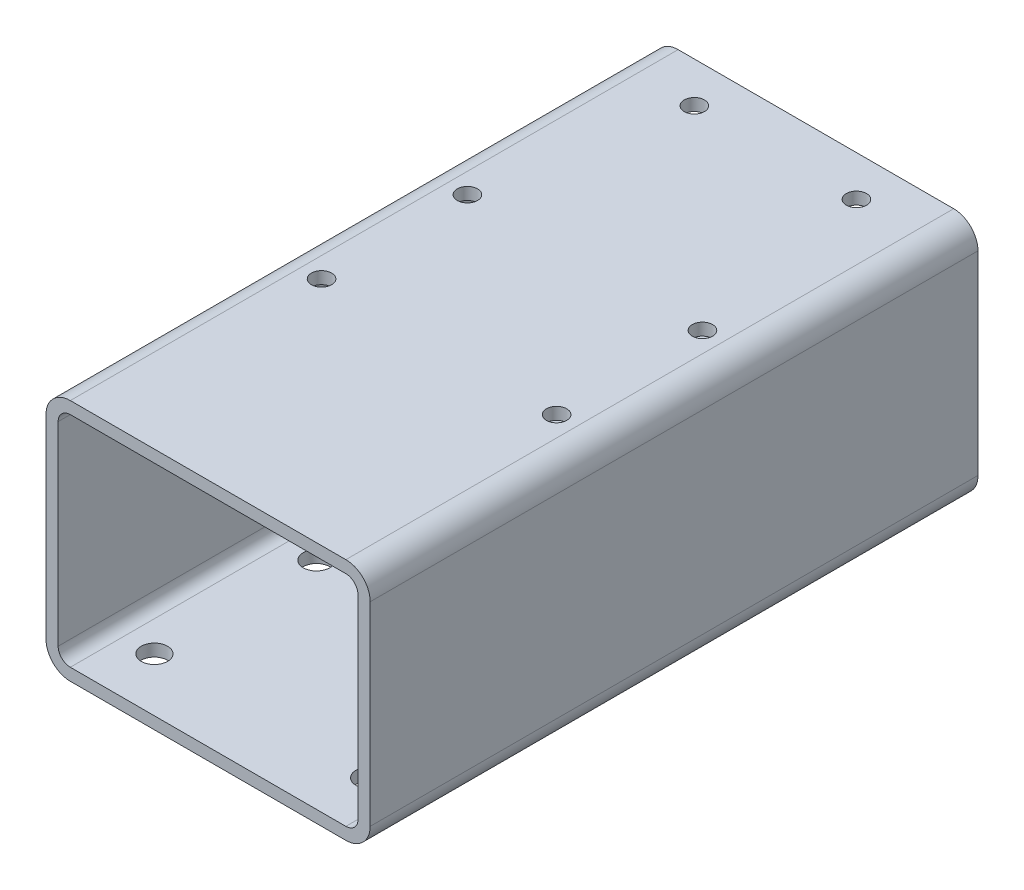
ISO-10303-21;
HEADER;
FILE_DESCRIPTION(('STEP AP214'),'2;1');
FILE_NAME('part.step','',(''),(''),'','','');
FILE_SCHEMA(('AUTOMOTIVE_DESIGN { 1 0 10303 214 1 1 1 1 }'));
ENDSEC;
DATA;
#1=APPLICATION_CONTEXT('core data for automotive mechanical design processes');
#2=APPLICATION_PROTOCOL_DEFINITION('international standard','automotive_design',2000,#1);
#3=PRODUCT_CONTEXT('',#1,'mechanical');
#4=PRODUCT('Part','Part','',(#3));
#5=PRODUCT_RELATED_PRODUCT_CATEGORY('part','',(#4));
#6=PRODUCT_DEFINITION_FORMATION('','',#4);
#7=PRODUCT_DEFINITION_CONTEXT('part definition',#1,'design');
#8=PRODUCT_DEFINITION('design','',#6,#7);
#9=PRODUCT_DEFINITION_SHAPE('','',#8);
#10=(LENGTH_UNIT() NAMED_UNIT(*) SI_UNIT(.MILLI.,.METRE.));
#11=(NAMED_UNIT(*) PLANE_ANGLE_UNIT() SI_UNIT($,.RADIAN.));
#12=(NAMED_UNIT(*) SI_UNIT($,.STERADIAN.) SOLID_ANGLE_UNIT());
#13=UNCERTAINTY_MEASURE_WITH_UNIT(LENGTH_MEASURE(1.E-05),#10,'distance_accuracy_value','');
#14=(GEOMETRIC_REPRESENTATION_CONTEXT(3) GLOBAL_UNCERTAINTY_ASSIGNED_CONTEXT((#13)) GLOBAL_UNIT_ASSIGNED_CONTEXT((#10,
#11,#12)) REPRESENTATION_CONTEXT('',''));
#15=CARTESIAN_POINT('',(0.,0.,0.));
#16=DIRECTION('',(0.,0.,1.));
#17=DIRECTION('',(1.,0.,0.));
#18=AXIS2_PLACEMENT_3D('',#15,#16,#17);
#19=CARTESIAN_POINT('',(-34.,24.,-75.));
#20=DIRECTION('',(0.,0.,1.));
#21=DIRECTION('',(1.,0.,0.));
#22=AXIS2_PLACEMENT_3D('',#19,#20,#21);
#23=CYLINDRICAL_SURFACE('',#22,6.);
#24=DIRECTION('',(0.,0.,1.));
#25=VECTOR('',#24,1.);
#26=CARTESIAN_POINT('',(-40.,24.,-75.));
#27=LINE('',#26,#25);
#28=CARTESIAN_POINT('',(-40.,24.,-75.));
#29=VERTEX_POINT('',#28);
#30=CARTESIAN_POINT('',(-40.,24.,75.));
#31=VERTEX_POINT('',#30);
#32=EDGE_CURVE('E42',#29,#31,#27,.T.);
#33=ORIENTED_EDGE('',*,*,#32,.T.);
#34=CARTESIAN_POINT('',(-34.,24.,75.));
#35=DIRECTION('',(0.,0.,1.));
#36=DIRECTION('',(-1.,0.,0.));
#37=AXIS2_PLACEMENT_3D('',#34,#35,#36);
#38=CIRCLE('',#37,6.);
#39=CARTESIAN_POINT('',(-34.,30.,75.));
#40=VERTEX_POINT('',#39);
#41=EDGE_CURVE('E197',#40,#31,#38,.T.);
#42=ORIENTED_EDGE('',*,*,#41,.F.);
#43=DIRECTION('',(0.,0.,1.));
#44=VECTOR('',#43,1.);
#45=CARTESIAN_POINT('',(-34.,30.,-75.));
#46=LINE('',#45,#44);
#47=CARTESIAN_POINT('',(-34.,30.,-75.));
#48=VERTEX_POINT('',#47);
#49=EDGE_CURVE('E11',#48,#40,#46,.T.);
#50=ORIENTED_EDGE('',*,*,#49,.F.);
#51=CARTESIAN_POINT('',(-34.,24.,-75.));
#52=DIRECTION('',(0.,0.,1.));
#53=DIRECTION('',(-1.,0.,0.));
#54=AXIS2_PLACEMENT_3D('',#51,#52,#53);
#55=CIRCLE('',#54,6.);
#56=EDGE_CURVE('E240',#48,#29,#55,.T.);
#57=ORIENTED_EDGE('',*,*,#56,.T.);
#58=EDGE_LOOP('',(#33,#42,#50,#57));
#59=FACE_BOUND('',#58,.T.);
#60=ADVANCED_FACE('F39',(#59),#23,.T.);
#61=CARTESIAN_POINT('',(-34.,30.,-75.));
#62=DIRECTION('',(0.,1.,0.));
#63=DIRECTION('',(-1.,0.,0.));
#64=AXIS2_PLACEMENT_3D('',#61,#62,#63);
#65=PLANE('',#64);
#66=CARTESIAN_POINT('',(29.0000000011443,30.,-18.0000000000055));
#67=DIRECTION('',(0.,1.,0.));
#68=DIRECTION('',(0.,0.,1.));
#69=AXIS2_PLACEMENT_3D('',#66,#67,#68);
#70=CIRCLE('',#69,2.5);
#71=CARTESIAN_POINT('',(29.0000000011443,30.,-15.5000000000055));
#72=VERTEX_POINT('',#71);
#73=EDGE_CURVE('E716',#72,#72,#70,.T.);
#74=ORIENTED_EDGE('',*,*,#73,.F.);
#75=EDGE_LOOP('',(#74));
#76=FACE_BOUND('',#75,.T.);
#77=CARTESIAN_POINT('',(29.0000000011443,30.,17.9999999999944));
#78=DIRECTION('',(0.,1.,0.));
#79=DIRECTION('',(0.,0.,1.));
#80=AXIS2_PLACEMENT_3D('',#77,#78,#79);
#81=CIRCLE('',#80,2.5);
#82=CARTESIAN_POINT('',(29.0000000011443,30.,20.4999999999945));
#83=VERTEX_POINT('',#82);
#84=EDGE_CURVE('E710',#83,#83,#81,.T.);
#85=ORIENTED_EDGE('',*,*,#84,.F.);
#86=EDGE_LOOP('',(#85));
#87=FACE_BOUND('',#86,.T.);
#88=CARTESIAN_POINT('',(-28.9999999988557,30.,17.9999999999944));
#89=DIRECTION('',(0.,1.,0.));
#90=DIRECTION('',(0.,0.,1.));
#91=AXIS2_PLACEMENT_3D('',#88,#89,#90);
#92=CIRCLE('',#91,2.5);
#93=CARTESIAN_POINT('',(-28.9999999988557,30.,20.4999999999944));
#94=VERTEX_POINT('',#93);
#95=EDGE_CURVE('E704',#94,#94,#92,.T.);
#96=ORIENTED_EDGE('',*,*,#95,.F.);
#97=EDGE_LOOP('',(#96));
#98=FACE_BOUND('',#97,.T.);
#99=CARTESIAN_POINT('',(-28.9999999988557,30.,-18.0000000000055));
#100=DIRECTION('',(0.,1.,0.));
#101=DIRECTION('',(0.,0.,1.));
#102=AXIS2_PLACEMENT_3D('',#99,#100,#101);
#103=CIRCLE('',#102,2.5);
#104=CARTESIAN_POINT('',(-28.9999999988557,30.,-15.5000000000056));
#105=VERTEX_POINT('',#104);
#106=EDGE_CURVE('E698',#105,#105,#103,.T.);
#107=ORIENTED_EDGE('',*,*,#106,.F.);
#108=EDGE_LOOP('',(#107));
#109=FACE_BOUND('',#108,.T.);
#110=CARTESIAN_POINT('',(-19.9999999988565,30.,-65.0000000000091));
#111=DIRECTION('',(0.,1.,0.));
#112=DIRECTION('',(0.,0.,1.));
#113=AXIS2_PLACEMENT_3D('',#110,#111,#112);
#114=CIRCLE('',#113,2.5);
#115=CARTESIAN_POINT('',(-19.9999999988565,30.,-62.5000000000091));
#116=VERTEX_POINT('',#115);
#117=EDGE_CURVE('E692',#116,#116,#114,.T.);
#118=ORIENTED_EDGE('',*,*,#117,.F.);
#119=EDGE_LOOP('',(#118));
#120=FACE_BOUND('',#119,.T.);
#121=CARTESIAN_POINT('',(20.0000000011434,30.,-65.0000000000081));
#122=DIRECTION('',(0.,1.,0.));
#123=DIRECTION('',(0.,0.,1.));
#124=AXIS2_PLACEMENT_3D('',#121,#122,#123);
#125=CIRCLE('',#124,2.5);
#126=CARTESIAN_POINT('',(20.0000000011434,30.,-62.5000000000081));
#127=VERTEX_POINT('',#126);
#128=EDGE_CURVE('E686',#127,#127,#125,.T.);
#129=ORIENTED_EDGE('',*,*,#128,.F.);
#130=EDGE_LOOP('',(#129));
#131=FACE_BOUND('',#130,.T.);
#132=ORIENTED_EDGE('',*,*,#49,.T.);
#133=DIRECTION('',(-1.,0.,0.));
#134=VECTOR('',#133,1.);
#135=CARTESIAN_POINT('',(-34.,30.,75.));
#136=LINE('',#135,#134);
#137=CARTESIAN_POINT('',(34.,30.,75.));
#138=VERTEX_POINT('',#137);
#139=EDGE_CURVE('E218',#138,#40,#136,.T.);
#140=ORIENTED_EDGE('',*,*,#139,.F.);
#141=DIRECTION('',(0.,0.,1.));
#142=VECTOR('',#141,1.);
#143=CARTESIAN_POINT('',(34.,30.,-75.));
#144=LINE('',#143,#142);
#145=CARTESIAN_POINT('',(34.,30.,-75.));
#146=VERTEX_POINT('',#145);
#147=EDGE_CURVE('E47',#146,#138,#144,.T.);
#148=ORIENTED_EDGE('',*,*,#147,.F.);
#149=DIRECTION('',(-1.,0.,0.));
#150=VECTOR('',#149,1.);
#151=CARTESIAN_POINT('',(-34.,30.,-75.));
#152=LINE('',#151,#150);
#153=EDGE_CURVE('E271',#146,#48,#152,.T.);
#154=ORIENTED_EDGE('',*,*,#153,.T.);
#155=EDGE_LOOP('',(#132,#140,#148,#154));
#156=FACE_BOUND('',#155,.T.);
#157=ADVANCED_FACE('F292',(#76,#87,#98,#109,#120,#131,#156),#65,.T.);
#158=CARTESIAN_POINT('',(34.,24.,-75.));
#159=DIRECTION('',(0.,0.,1.));
#160=DIRECTION('',(1.,0.,0.));
#161=AXIS2_PLACEMENT_3D('',#158,#159,#160);
#162=CYLINDRICAL_SURFACE('',#161,6.);
#163=ORIENTED_EDGE('',*,*,#147,.T.);
#164=CARTESIAN_POINT('',(34.,24.,75.));
#165=DIRECTION('',(0.,0.,1.));
#166=DIRECTION('',(1.,0.,0.));
#167=AXIS2_PLACEMENT_3D('',#164,#165,#166);
#168=CIRCLE('',#167,6.);
#169=CARTESIAN_POINT('',(40.,24.,75.));
#170=VERTEX_POINT('',#169);
#171=EDGE_CURVE('E215',#170,#138,#168,.T.);
#172=ORIENTED_EDGE('',*,*,#171,.F.);
#173=DIRECTION('',(0.,0.,1.));
#174=VECTOR('',#173,1.);
#175=CARTESIAN_POINT('',(40.,24.,-75.));
#176=LINE('',#175,#174);
#177=CARTESIAN_POINT('',(40.,24.,-75.));
#178=VERTEX_POINT('',#177);
#179=EDGE_CURVE('E275',#178,#170,#176,.T.);
#180=ORIENTED_EDGE('',*,*,#179,.F.);
#181=CARTESIAN_POINT('',(34.,24.,-75.));
#182=DIRECTION('',(0.,0.,1.));
#183=DIRECTION('',(1.,0.,0.));
#184=AXIS2_PLACEMENT_3D('',#181,#182,#183);
#185=CIRCLE('',#184,6.);
#186=EDGE_CURVE('E268',#178,#146,#185,.T.);
#187=ORIENTED_EDGE('',*,*,#186,.T.);
#188=EDGE_LOOP('',(#163,#172,#180,#187));
#189=FACE_BOUND('',#188,.T.);
#190=ADVANCED_FACE('F313',(#189),#162,.T.);
#191=CARTESIAN_POINT('',(40.,-24.,-75.));
#192=DIRECTION('',(1.,0.,0.));
#193=DIRECTION('',(0.,0.,-1.));
#194=AXIS2_PLACEMENT_3D('',#191,#192,#193);
#195=PLANE('',#194);
#196=ORIENTED_EDGE('',*,*,#179,.T.);
#197=DIRECTION('',(0.,1.,0.));
#198=VECTOR('',#197,1.);
#199=CARTESIAN_POINT('',(40.,-24.,75.));
#200=LINE('',#199,#198);
#201=CARTESIAN_POINT('',(40.,-24.,75.));
#202=VERTEX_POINT('',#201);
#203=EDGE_CURVE('E212',#202,#170,#200,.T.);
#204=ORIENTED_EDGE('',*,*,#203,.F.);
#205=DIRECTION('',(0.,0.,1.));
#206=VECTOR('',#205,1.);
#207=CARTESIAN_POINT('',(40.,-24.,-75.));
#208=LINE('',#207,#206);
#209=CARTESIAN_POINT('',(40.,-24.,-75.));
#210=VERTEX_POINT('',#209);
#211=EDGE_CURVE('E277',#210,#202,#208,.T.);
#212=ORIENTED_EDGE('',*,*,#211,.F.);
#213=DIRECTION('',(0.,1.,0.));
#214=VECTOR('',#213,1.);
#215=CARTESIAN_POINT('',(40.,-24.,-75.));
#216=LINE('',#215,#214);
#217=EDGE_CURVE('E265',#210,#178,#216,.T.);
#218=ORIENTED_EDGE('',*,*,#217,.T.);
#219=EDGE_LOOP('',(#196,#204,#212,#218));
#220=FACE_BOUND('',#219,.T.);
#221=ADVANCED_FACE('F310',(#220),#195,.T.);
#222=CARTESIAN_POINT('',(34.,-24.,-75.));
#223=DIRECTION('',(0.,0.,1.));
#224=DIRECTION('',(1.,0.,0.));
#225=AXIS2_PLACEMENT_3D('',#222,#223,#224);
#226=CYLINDRICAL_SURFACE('',#225,6.);
#227=ORIENTED_EDGE('',*,*,#211,.T.);
#228=CARTESIAN_POINT('',(34.,-24.,75.));
#229=DIRECTION('',(0.,0.,1.));
#230=DIRECTION('',(1.,0.,0.));
#231=AXIS2_PLACEMENT_3D('',#228,#229,#230);
#232=CIRCLE('',#231,6.);
#233=CARTESIAN_POINT('',(34.,-30.,75.));
#234=VERTEX_POINT('',#233);
#235=EDGE_CURVE('E209',#234,#202,#232,.T.);
#236=ORIENTED_EDGE('',*,*,#235,.F.);
#237=DIRECTION('',(0.,0.,1.));
#238=VECTOR('',#237,1.);
#239=CARTESIAN_POINT('',(34.,-30.,-75.));
#240=LINE('',#239,#238);
#241=CARTESIAN_POINT('',(34.,-30.,-75.));
#242=VERTEX_POINT('',#241);
#243=EDGE_CURVE('E279',#242,#234,#240,.T.);
#244=ORIENTED_EDGE('',*,*,#243,.F.);
#245=CARTESIAN_POINT('',(34.,-24.,-75.));
#246=DIRECTION('',(0.,0.,1.));
#247=DIRECTION('',(1.,0.,0.));
#248=AXIS2_PLACEMENT_3D('',#245,#246,#247);
#249=CIRCLE('',#248,6.);
#250=EDGE_CURVE('E262',#242,#210,#249,.T.);
#251=ORIENTED_EDGE('',*,*,#250,.T.);
#252=EDGE_LOOP('',(#227,#236,#244,#251));
#253=FACE_BOUND('',#252,.T.);
#254=ADVANCED_FACE('F308',(#253),#226,.T.);
#255=CARTESIAN_POINT('',(-34.,-30.,-75.));
#256=DIRECTION('',(0.,-1.,0.));
#257=DIRECTION('',(0.,0.,-1.));
#258=AXIS2_PLACEMENT_3D('',#255,#256,#257);
#259=PLANE('',#258);
#260=CARTESIAN_POINT('',(-26.5,-30.,61.75));
#261=DIRECTION('',(0.,-1.,0.));
#262=DIRECTION('',(0.,0.,-1.));
#263=AXIS2_PLACEMENT_3D('',#260,#261,#262);
#264=CIRCLE('',#263,3.24999999999999);
#265=CARTESIAN_POINT('',(-26.5,-30.,58.5));
#266=VERTEX_POINT('',#265);
#267=EDGE_CURVE('E623',#266,#266,#264,.T.);
#268=ORIENTED_EDGE('',*,*,#267,.F.);
#269=EDGE_LOOP('',(#268));
#270=FACE_BOUND('',#269,.T.);
#271=CARTESIAN_POINT('',(26.5,-30.,61.75));
#272=DIRECTION('',(0.,-1.,0.));
#273=DIRECTION('',(0.,0.,-1.));
#274=AXIS2_PLACEMENT_3D('',#271,#272,#273);
#275=CIRCLE('',#274,3.24999999999999);
#276=CARTESIAN_POINT('',(26.5,-30.,58.5));
#277=VERTEX_POINT('',#276);
#278=EDGE_CURVE('E627',#277,#277,#275,.T.);
#279=ORIENTED_EDGE('',*,*,#278,.F.);
#280=EDGE_LOOP('',(#279));
#281=FACE_BOUND('',#280,.T.);
#282=CARTESIAN_POINT('',(26.5,-30.,21.75));
#283=DIRECTION('',(0.,-1.,0.));
#284=DIRECTION('',(0.,0.,-1.));
#285=AXIS2_PLACEMENT_3D('',#282,#283,#284);
#286=CIRCLE('',#285,3.24999999999999);
#287=CARTESIAN_POINT('',(26.5,-30.,18.5));
#288=VERTEX_POINT('',#287);
#289=EDGE_CURVE('E631',#288,#288,#286,.T.);
#290=ORIENTED_EDGE('',*,*,#289,.F.);
#291=EDGE_LOOP('',(#290));
#292=FACE_BOUND('',#291,.T.);
#293=CARTESIAN_POINT('',(-26.5,-30.,21.75));
#294=DIRECTION('',(0.,-1.,0.));
#295=DIRECTION('',(0.,0.,-1.));
#296=AXIS2_PLACEMENT_3D('',#293,#294,#295);
#297=CIRCLE('',#296,3.24999999999999);
#298=CARTESIAN_POINT('',(-26.5,-30.,18.5));
#299=VERTEX_POINT('',#298);
#300=EDGE_CURVE('E635',#299,#299,#297,.T.);
#301=ORIENTED_EDGE('',*,*,#300,.F.);
#302=EDGE_LOOP('',(#301));
#303=FACE_BOUND('',#302,.T.);
#304=CARTESIAN_POINT('',(-26.5,-30.,-21.75));
#305=DIRECTION('',(0.,-1.,0.));
#306=DIRECTION('',(0.,0.,-1.));
#307=AXIS2_PLACEMENT_3D('',#304,#305,#306);
#308=CIRCLE('',#307,3.24999999999999);
#309=CARTESIAN_POINT('',(-26.5,-30.,-25.));
#310=VERTEX_POINT('',#309);
#311=EDGE_CURVE('E639',#310,#310,#308,.T.);
#312=ORIENTED_EDGE('',*,*,#311,.F.);
#313=EDGE_LOOP('',(#312));
#314=FACE_BOUND('',#313,.T.);
#315=CARTESIAN_POINT('',(26.5,-30.,-21.75));
#316=DIRECTION('',(0.,-1.,0.));
#317=DIRECTION('',(0.,0.,-1.));
#318=AXIS2_PLACEMENT_3D('',#315,#316,#317);
#319=CIRCLE('',#318,3.24999999999999);
#320=CARTESIAN_POINT('',(26.5,-30.,-25.));
#321=VERTEX_POINT('',#320);
#322=EDGE_CURVE('E643',#321,#321,#319,.T.);
#323=ORIENTED_EDGE('',*,*,#322,.F.);
#324=EDGE_LOOP('',(#323));
#325=FACE_BOUND('',#324,.T.);
#326=CARTESIAN_POINT('',(26.5,-30.,-61.75));
#327=DIRECTION('',(0.,-1.,0.));
#328=DIRECTION('',(0.,0.,-1.));
#329=AXIS2_PLACEMENT_3D('',#326,#327,#328);
#330=CIRCLE('',#329,3.24999999999999);
#331=CARTESIAN_POINT('',(26.5,-30.,-65.));
#332=VERTEX_POINT('',#331);
#333=EDGE_CURVE('E647',#332,#332,#330,.T.);
#334=ORIENTED_EDGE('',*,*,#333,.F.);
#335=EDGE_LOOP('',(#334));
#336=FACE_BOUND('',#335,.T.);
#337=CARTESIAN_POINT('',(-26.5,-30.,-61.75));
#338=DIRECTION('',(0.,-1.,0.));
#339=DIRECTION('',(0.,0.,-1.));
#340=AXIS2_PLACEMENT_3D('',#337,#338,#339);
#341=CIRCLE('',#340,3.24999999999999);
#342=CARTESIAN_POINT('',(-26.5,-30.,-65.));
#343=VERTEX_POINT('',#342);
#344=EDGE_CURVE('E650',#343,#343,#341,.T.);
#345=ORIENTED_EDGE('',*,*,#344,.F.);
#346=EDGE_LOOP('',(#345));
#347=FACE_BOUND('',#346,.T.);
#348=ORIENTED_EDGE('',*,*,#243,.T.);
#349=DIRECTION('',(1.,0.,0.));
#350=VECTOR('',#349,1.);
#351=CARTESIAN_POINT('',(-34.,-30.,75.));
#352=LINE('',#351,#350);
#353=CARTESIAN_POINT('',(-34.,-30.,75.));
#354=VERTEX_POINT('',#353);
#355=EDGE_CURVE('E206',#354,#234,#352,.T.);
#356=ORIENTED_EDGE('',*,*,#355,.F.);
#357=DIRECTION('',(0.,0.,1.));
#358=VECTOR('',#357,1.);
#359=CARTESIAN_POINT('',(-34.,-30.,-75.));
#360=LINE('',#359,#358);
#361=CARTESIAN_POINT('',(-34.,-30.,-75.));
#362=VERTEX_POINT('',#361);
#363=EDGE_CURVE('E281',#362,#354,#360,.T.);
#364=ORIENTED_EDGE('',*,*,#363,.F.);
#365=DIRECTION('',(1.,0.,0.));
#366=VECTOR('',#365,1.);
#367=CARTESIAN_POINT('',(-34.,-30.,-75.));
#368=LINE('',#367,#366);
#369=EDGE_CURVE('E259',#362,#242,#368,.T.);
#370=ORIENTED_EDGE('',*,*,#369,.T.);
#371=EDGE_LOOP('',(#348,#356,#364,#370));
#372=FACE_BOUND('',#371,.T.);
#373=ADVANCED_FACE('F306',(#270,#281,#292,#303,#314,#325,#336,#347,#372),#259,.T.);
#374=CARTESIAN_POINT('',(-34.,-24.,-75.));
#375=DIRECTION('',(0.,0.,1.));
#376=DIRECTION('',(1.,0.,0.));
#377=AXIS2_PLACEMENT_3D('',#374,#375,#376);
#378=CYLINDRICAL_SURFACE('',#377,6.);
#379=ORIENTED_EDGE('',*,*,#363,.T.);
#380=CARTESIAN_POINT('',(-34.,-24.,75.));
#381=DIRECTION('',(0.,0.,1.));
#382=DIRECTION('',(-1.,0.,0.));
#383=AXIS2_PLACEMENT_3D('',#380,#381,#382);
#384=CIRCLE('',#383,6.);
#385=CARTESIAN_POINT('',(-40.,-24.,75.));
#386=VERTEX_POINT('',#385);
#387=EDGE_CURVE('E203',#386,#354,#384,.T.);
#388=ORIENTED_EDGE('',*,*,#387,.F.);
#389=DIRECTION('',(0.,0.,1.));
#390=VECTOR('',#389,1.);
#391=CARTESIAN_POINT('',(-40.,-24.,-75.));
#392=LINE('',#391,#390);
#393=CARTESIAN_POINT('',(-40.,-24.,-75.));
#394=VERTEX_POINT('',#393);
#395=EDGE_CURVE('E282',#394,#386,#392,.T.);
#396=ORIENTED_EDGE('',*,*,#395,.F.);
#397=CARTESIAN_POINT('',(-34.,-24.,-75.));
#398=DIRECTION('',(0.,0.,1.));
#399=DIRECTION('',(-1.,0.,0.));
#400=AXIS2_PLACEMENT_3D('',#397,#398,#399);
#401=CIRCLE('',#400,6.);
#402=EDGE_CURVE('E256',#394,#362,#401,.T.);
#403=ORIENTED_EDGE('',*,*,#402,.T.);
#404=EDGE_LOOP('',(#379,#388,#396,#403));
#405=FACE_BOUND('',#404,.T.);
#406=ADVANCED_FACE('F302',(#405),#378,.T.);
#407=CARTESIAN_POINT('',(-40.,-24.,-75.));
#408=DIRECTION('',(-1.,0.,0.));
#409=DIRECTION('',(0.,0.,1.));
#410=AXIS2_PLACEMENT_3D('',#407,#408,#409);
#411=PLANE('',#410);
#412=ORIENTED_EDGE('',*,*,#395,.T.);
#413=DIRECTION('',(0.,-1.,0.));
#414=VECTOR('',#413,1.);
#415=CARTESIAN_POINT('',(-40.,-24.,75.));
#416=LINE('',#415,#414);
#417=EDGE_CURVE('E200',#31,#386,#416,.T.);
#418=ORIENTED_EDGE('',*,*,#417,.F.);
#419=ORIENTED_EDGE('',*,*,#32,.F.);
#420=DIRECTION('',(0.,-1.,0.));
#421=VECTOR('',#420,1.);
#422=CARTESIAN_POINT('',(-40.,-24.,-75.));
#423=LINE('',#422,#421);
#424=EDGE_CURVE('E253',#29,#394,#423,.T.);
#425=ORIENTED_EDGE('',*,*,#424,.T.);
#426=EDGE_LOOP('',(#412,#418,#419,#425));
#427=FACE_BOUND('',#426,.T.);
#428=ADVANCED_FACE('F286',(#427),#411,.T.);
#429=CARTESIAN_POINT('',(-34.,24.,-75.));
#430=DIRECTION('',(0.,0.,-1.));
#431=DIRECTION('',(-1.,0.,0.));
#432=AXIS2_PLACEMENT_3D('',#429,#430,#431);
#433=PLANE('',#432);
#434=CARTESIAN_POINT('',(-34.,24.,-75.));
#435=DIRECTION('',(0.,0.,1.));
#436=DIRECTION('',(-1.,0.,0.));
#437=AXIS2_PLACEMENT_3D('',#434,#435,#436);
#438=CIRCLE('',#437,3.);
#439=CARTESIAN_POINT('',(-34.,27.,-75.));
#440=VERTEX_POINT('',#439);
#441=CARTESIAN_POINT('',(-37.,24.,-75.));
#442=VERTEX_POINT('',#441);
#443=EDGE_CURVE('E221',#440,#442,#438,.T.);
#444=ORIENTED_EDGE('',*,*,#443,.T.);
#445=DIRECTION('',(0.,-1.,0.));
#446=VECTOR('',#445,1.);
#447=CARTESIAN_POINT('',(-37.,-24.,-75.));
#448=LINE('',#447,#446);
#449=CARTESIAN_POINT('',(-37.,-24.,-75.));
#450=VERTEX_POINT('',#449);
#451=EDGE_CURVE('E159',#442,#450,#448,.T.);
#452=ORIENTED_EDGE('',*,*,#451,.T.);
#453=CARTESIAN_POINT('',(-34.,-24.,-75.));
#454=DIRECTION('',(0.,0.,1.));
#455=DIRECTION('',(-1.,0.,0.));
#456=AXIS2_PLACEMENT_3D('',#453,#454,#455);
#457=CIRCLE('',#456,3.);
#458=CARTESIAN_POINT('',(-34.,-27.,-75.));
#459=VERTEX_POINT('',#458);
#460=EDGE_CURVE('E55',#450,#459,#457,.T.);
#461=ORIENTED_EDGE('',*,*,#460,.T.);
#462=DIRECTION('',(1.,0.,0.));
#463=VECTOR('',#462,1.);
#464=CARTESIAN_POINT('',(-34.,-27.,-75.));
#465=LINE('',#464,#463);
#466=CARTESIAN_POINT('',(34.,-27.,-75.));
#467=VERTEX_POINT('',#466);
#468=EDGE_CURVE('E225',#459,#467,#465,.T.);
#469=ORIENTED_EDGE('',*,*,#468,.T.);
#470=CARTESIAN_POINT('',(34.,-24.,-75.));
#471=DIRECTION('',(0.,0.,1.));
#472=DIRECTION('',(1.,0.,0.));
#473=AXIS2_PLACEMENT_3D('',#470,#471,#472);
#474=CIRCLE('',#473,3.);
#475=CARTESIAN_POINT('',(37.,-24.,-75.));
#476=VERTEX_POINT('',#475);
#477=EDGE_CURVE('E228',#467,#476,#474,.T.);
#478=ORIENTED_EDGE('',*,*,#477,.T.);
#479=DIRECTION('',(0.,1.,0.));
#480=VECTOR('',#479,1.);
#481=CARTESIAN_POINT('',(37.,-24.,-75.));
#482=LINE('',#481,#480);
#483=CARTESIAN_POINT('',(37.,24.,-75.));
#484=VERTEX_POINT('',#483);
#485=EDGE_CURVE('E231',#476,#484,#482,.T.);
#486=ORIENTED_EDGE('',*,*,#485,.T.);
#487=CARTESIAN_POINT('',(34.,24.,-75.));
#488=DIRECTION('',(0.,0.,1.));
#489=DIRECTION('',(1.,0.,0.));
#490=AXIS2_PLACEMENT_3D('',#487,#488,#489);
#491=CIRCLE('',#490,3.);
#492=CARTESIAN_POINT('',(34.,27.,-75.));
#493=VERTEX_POINT('',#492);
#494=EDGE_CURVE('E234',#484,#493,#491,.T.);
#495=ORIENTED_EDGE('',*,*,#494,.T.);
#496=DIRECTION('',(-1.,0.,0.));
#497=VECTOR('',#496,1.);
#498=CARTESIAN_POINT('',(-34.,27.,-75.));
#499=LINE('',#498,#497);
#500=EDGE_CURVE('E164',#493,#440,#499,.T.);
#501=ORIENTED_EDGE('',*,*,#500,.T.);
#502=EDGE_LOOP('',(#444,#452,#461,#469,#478,#486,#495,#501));
#503=FACE_BOUND('',#502,.T.);
#504=ORIENTED_EDGE('',*,*,#56,.F.);
#505=ORIENTED_EDGE('',*,*,#153,.F.);
#506=ORIENTED_EDGE('',*,*,#186,.F.);
#507=ORIENTED_EDGE('',*,*,#217,.F.);
#508=ORIENTED_EDGE('',*,*,#250,.F.);
#509=ORIENTED_EDGE('',*,*,#369,.F.);
#510=ORIENTED_EDGE('',*,*,#402,.F.);
#511=ORIENTED_EDGE('',*,*,#424,.F.);
#512=EDGE_LOOP('',(#504,#505,#506,#507,#508,#509,#510,#511));
#513=FACE_BOUND('',#512,.T.);
#514=ADVANCED_FACE('F296',(#503,#513),#433,.T.);
#515=CARTESIAN_POINT('',(-34.,24.,-75.));
#516=DIRECTION('',(0.,0.,1.));
#517=DIRECTION('',(1.,0.,0.));
#518=AXIS2_PLACEMENT_3D('',#515,#516,#517);
#519=CYLINDRICAL_SURFACE('',#518,3.);
#520=DIRECTION('',(0.,0.,1.));
#521=VECTOR('',#520,1.);
#522=CARTESIAN_POINT('',(-34.,27.,-75.));
#523=LINE('',#522,#521);
#524=CARTESIAN_POINT('',(-34.,27.,75.));
#525=VERTEX_POINT('',#524);
#526=EDGE_CURVE('E169',#440,#525,#523,.T.);
#527=ORIENTED_EDGE('',*,*,#526,.T.);
#528=CARTESIAN_POINT('',(-34.,24.,75.));
#529=DIRECTION('',(0.,0.,1.));
#530=DIRECTION('',(-1.,0.,0.));
#531=AXIS2_PLACEMENT_3D('',#528,#529,#530);
#532=CIRCLE('',#531,3.);
#533=CARTESIAN_POINT('',(-37.,24.,75.));
#534=VERTEX_POINT('',#533);
#535=EDGE_CURVE('E167',#525,#534,#532,.T.);
#536=ORIENTED_EDGE('',*,*,#535,.T.);
#537=DIRECTION('',(0.,0.,1.));
#538=VECTOR('',#537,1.);
#539=CARTESIAN_POINT('',(-37.,24.,-75.));
#540=LINE('',#539,#538);
#541=EDGE_CURVE('E152',#442,#534,#540,.T.);
#542=ORIENTED_EDGE('',*,*,#541,.F.);
#543=ORIENTED_EDGE('',*,*,#443,.F.);
#544=EDGE_LOOP('',(#527,#536,#542,#543));
#545=FACE_BOUND('',#544,.T.);
#546=ADVANCED_FACE('F168',(#545),#519,.F.);
#547=CARTESIAN_POINT('',(-34.,27.,-75.));
#548=DIRECTION('',(0.,1.,0.));
#549=DIRECTION('',(0.,0.,1.));
#550=AXIS2_PLACEMENT_3D('',#547,#548,#549);
#551=PLANE('',#550);
#552=CARTESIAN_POINT('',(29.0000000011443,27.,-18.0000000000055));
#553=DIRECTION('',(0.,1.,0.));
#554=DIRECTION('',(0.,0.,1.));
#555=AXIS2_PLACEMENT_3D('',#552,#553,#554);
#556=CIRCLE('',#555,2.5);
#557=CARTESIAN_POINT('',(29.0000000011443,27.,-15.5000000000055));
#558=VERTEX_POINT('',#557);
#559=EDGE_CURVE('E713',#558,#558,#556,.T.);
#560=ORIENTED_EDGE('',*,*,#559,.T.);
#561=EDGE_LOOP('',(#560));
#562=FACE_BOUND('',#561,.T.);
#563=CARTESIAN_POINT('',(29.0000000011443,27.,17.9999999999944));
#564=DIRECTION('',(0.,1.,0.));
#565=DIRECTION('',(0.,0.,1.));
#566=AXIS2_PLACEMENT_3D('',#563,#564,#565);
#567=CIRCLE('',#566,2.5);
#568=CARTESIAN_POINT('',(29.0000000011443,27.,20.4999999999945));
#569=VERTEX_POINT('',#568);
#570=EDGE_CURVE('E707',#569,#569,#567,.T.);
#571=ORIENTED_EDGE('',*,*,#570,.T.);
#572=EDGE_LOOP('',(#571));
#573=FACE_BOUND('',#572,.T.);
#574=CARTESIAN_POINT('',(-28.9999999988557,27.,17.9999999999944));
#575=DIRECTION('',(0.,1.,0.));
#576=DIRECTION('',(0.,0.,1.));
#577=AXIS2_PLACEMENT_3D('',#574,#575,#576);
#578=CIRCLE('',#577,2.5);
#579=CARTESIAN_POINT('',(-28.9999999988557,27.,20.4999999999944));
#580=VERTEX_POINT('',#579);
#581=EDGE_CURVE('E701',#580,#580,#578,.T.);
#582=ORIENTED_EDGE('',*,*,#581,.T.);
#583=EDGE_LOOP('',(#582));
#584=FACE_BOUND('',#583,.T.);
#585=CARTESIAN_POINT('',(-28.9999999988557,27.,-18.0000000000055));
#586=DIRECTION('',(0.,1.,0.));
#587=DIRECTION('',(0.,0.,1.));
#588=AXIS2_PLACEMENT_3D('',#585,#586,#587);
#589=CIRCLE('',#588,2.5);
#590=CARTESIAN_POINT('',(-28.9999999988557,27.,-15.5000000000056));
#591=VERTEX_POINT('',#590);
#592=EDGE_CURVE('E695',#591,#591,#589,.T.);
#593=ORIENTED_EDGE('',*,*,#592,.T.);
#594=EDGE_LOOP('',(#593));
#595=FACE_BOUND('',#594,.T.);
#596=CARTESIAN_POINT('',(-19.9999999988565,27.,-65.0000000000091));
#597=DIRECTION('',(0.,1.,0.));
#598=DIRECTION('',(0.,0.,1.));
#599=AXIS2_PLACEMENT_3D('',#596,#597,#598);
#600=CIRCLE('',#599,2.5);
#601=CARTESIAN_POINT('',(-19.9999999988565,27.,-62.5000000000091));
#602=VERTEX_POINT('',#601);
#603=EDGE_CURVE('E689',#602,#602,#600,.T.);
#604=ORIENTED_EDGE('',*,*,#603,.T.);
#605=EDGE_LOOP('',(#604));
#606=FACE_BOUND('',#605,.T.);
#607=CARTESIAN_POINT('',(20.0000000011434,27.,-65.0000000000081));
#608=DIRECTION('',(0.,1.,0.));
#609=DIRECTION('',(0.,0.,1.));
#610=AXIS2_PLACEMENT_3D('',#607,#608,#609);
#611=CIRCLE('',#610,2.5);
#612=CARTESIAN_POINT('',(20.0000000011434,27.,-62.5000000000081));
#613=VERTEX_POINT('',#612);
#614=EDGE_CURVE('E683',#613,#613,#611,.T.);
#615=ORIENTED_EDGE('',*,*,#614,.T.);
#616=EDGE_LOOP('',(#615));
#617=FACE_BOUND('',#616,.T.);
#618=DIRECTION('',(0.,0.,1.));
#619=VECTOR('',#618,1.);
#620=CARTESIAN_POINT('',(34.,27.,-75.));
#621=LINE('',#620,#619);
#622=CARTESIAN_POINT('',(34.,27.,75.));
#623=VERTEX_POINT('',#622);
#624=EDGE_CURVE('E241',#493,#623,#621,.T.);
#625=ORIENTED_EDGE('',*,*,#624,.T.);
#626=DIRECTION('',(-1.,0.,0.));
#627=VECTOR('',#626,1.);
#628=CARTESIAN_POINT('',(-34.,27.,75.));
#629=LINE('',#628,#627);
#630=EDGE_CURVE('E195',#623,#525,#629,.T.);
#631=ORIENTED_EDGE('',*,*,#630,.T.);
#632=ORIENTED_EDGE('',*,*,#526,.F.);
#633=ORIENTED_EDGE('',*,*,#500,.F.);
#634=EDGE_LOOP('',(#625,#631,#632,#633));
#635=FACE_BOUND('',#634,.T.);
#636=ADVANCED_FACE('F342',(#562,#573,#584,#595,#606,#617,#635),#551,.F.);
#637=CARTESIAN_POINT('',(34.,24.,-75.));
#638=DIRECTION('',(0.,0.,1.));
#639=DIRECTION('',(1.,0.,0.));
#640=AXIS2_PLACEMENT_3D('',#637,#638,#639);
#641=CYLINDRICAL_SURFACE('',#640,3.);
#642=DIRECTION('',(0.,0.,1.));
#643=VECTOR('',#642,1.);
#644=CARTESIAN_POINT('',(37.,24.,-75.));
#645=LINE('',#644,#643);
#646=CARTESIAN_POINT('',(37.,24.,75.));
#647=VERTEX_POINT('',#646);
#648=EDGE_CURVE('E243',#484,#647,#645,.T.);
#649=ORIENTED_EDGE('',*,*,#648,.T.);
#650=CARTESIAN_POINT('',(34.,24.,75.));
#651=DIRECTION('',(0.,0.,1.));
#652=DIRECTION('',(1.,0.,0.));
#653=AXIS2_PLACEMENT_3D('',#650,#651,#652);
#654=CIRCLE('',#653,3.);
#655=EDGE_CURVE('E192',#647,#623,#654,.T.);
#656=ORIENTED_EDGE('',*,*,#655,.T.);
#657=ORIENTED_EDGE('',*,*,#624,.F.);
#658=ORIENTED_EDGE('',*,*,#494,.F.);
#659=EDGE_LOOP('',(#649,#656,#657,#658));
#660=FACE_BOUND('',#659,.T.);
#661=ADVANCED_FACE('F346',(#660),#641,.F.);
#662=CARTESIAN_POINT('',(37.,-24.,-75.));
#663=DIRECTION('',(1.,0.,0.));
#664=DIRECTION('',(0.,0.,-1.));
#665=AXIS2_PLACEMENT_3D('',#662,#663,#664);
#666=PLANE('',#665);
#667=DIRECTION('',(0.,0.,1.));
#668=VECTOR('',#667,1.);
#669=CARTESIAN_POINT('',(37.,-24.,-75.));
#670=LINE('',#669,#668);
#671=CARTESIAN_POINT('',(37.,-24.,75.));
#672=VERTEX_POINT('',#671);
#673=EDGE_CURVE('E245',#476,#672,#670,.T.);
#674=ORIENTED_EDGE('',*,*,#673,.T.);
#675=DIRECTION('',(0.,1.,0.));
#676=VECTOR('',#675,1.);
#677=CARTESIAN_POINT('',(37.,-24.,75.));
#678=LINE('',#677,#676);
#679=EDGE_CURVE('E189',#672,#647,#678,.T.);
#680=ORIENTED_EDGE('',*,*,#679,.T.);
#681=ORIENTED_EDGE('',*,*,#648,.F.);
#682=ORIENTED_EDGE('',*,*,#485,.F.);
#683=EDGE_LOOP('',(#674,#680,#681,#682));
#684=FACE_BOUND('',#683,.T.);
#685=ADVANCED_FACE('F448',(#684),#666,.F.);
#686=CARTESIAN_POINT('',(34.,-24.,-75.));
#687=DIRECTION('',(0.,0.,1.));
#688=DIRECTION('',(1.,0.,0.));
#689=AXIS2_PLACEMENT_3D('',#686,#687,#688);
#690=CYLINDRICAL_SURFACE('',#689,3.);
#691=DIRECTION('',(0.,0.,1.));
#692=VECTOR('',#691,1.);
#693=CARTESIAN_POINT('',(34.,-27.,-75.));
#694=LINE('',#693,#692);
#695=CARTESIAN_POINT('',(34.,-27.,75.));
#696=VERTEX_POINT('',#695);
#697=EDGE_CURVE('E247',#467,#696,#694,.T.);
#698=ORIENTED_EDGE('',*,*,#697,.T.);
#699=CARTESIAN_POINT('',(34.,-24.,75.));
#700=DIRECTION('',(0.,0.,1.));
#701=DIRECTION('',(1.,0.,0.));
#702=AXIS2_PLACEMENT_3D('',#699,#700,#701);
#703=CIRCLE('',#702,3.);
#704=EDGE_CURVE('E186',#696,#672,#703,.T.);
#705=ORIENTED_EDGE('',*,*,#704,.T.);
#706=ORIENTED_EDGE('',*,*,#673,.F.);
#707=ORIENTED_EDGE('',*,*,#477,.F.);
#708=EDGE_LOOP('',(#698,#705,#706,#707));
#709=FACE_BOUND('',#708,.T.);
#710=ADVANCED_FACE('F452',(#709),#690,.F.);
#711=CARTESIAN_POINT('',(-34.,-27.,-75.));
#712=DIRECTION('',(0.,-1.,0.));
#713=DIRECTION('',(1.,0.,0.));
#714=AXIS2_PLACEMENT_3D('',#711,#712,#713);
#715=PLANE('',#714);
#716=CARTESIAN_POINT('',(-26.5,-27.,61.75));
#717=DIRECTION('',(0.,-1.,0.));
#718=DIRECTION('',(1.,0.,0.));
#719=AXIS2_PLACEMENT_3D('',#716,#717,#718);
#720=CIRCLE('',#719,3.25);
#721=CARTESIAN_POINT('',(-23.25,-27.,61.75));
#722=VERTEX_POINT('',#721);
#723=EDGE_CURVE('E679',#722,#722,#720,.T.);
#724=ORIENTED_EDGE('',*,*,#723,.T.);
#725=EDGE_LOOP('',(#724));
#726=FACE_BOUND('',#725,.T.);
#727=CARTESIAN_POINT('',(26.5,-27.,61.75));
#728=DIRECTION('',(0.,-1.,0.));
#729=DIRECTION('',(1.,0.,0.));
#730=AXIS2_PLACEMENT_3D('',#727,#728,#729);
#731=CIRCLE('',#730,3.25);
#732=CARTESIAN_POINT('',(29.75,-27.,61.75));
#733=VERTEX_POINT('',#732);
#734=EDGE_CURVE('E675',#733,#733,#731,.T.);
#735=ORIENTED_EDGE('',*,*,#734,.T.);
#736=EDGE_LOOP('',(#735));
#737=FACE_BOUND('',#736,.T.);
#738=CARTESIAN_POINT('',(26.5,-27.,21.75));
#739=DIRECTION('',(0.,-1.,0.));
#740=DIRECTION('',(1.,0.,0.));
#741=AXIS2_PLACEMENT_3D('',#738,#739,#740);
#742=CIRCLE('',#741,3.25);
#743=CARTESIAN_POINT('',(29.75,-27.,21.75));
#744=VERTEX_POINT('',#743);
#745=EDGE_CURVE('E671',#744,#744,#742,.T.);
#746=ORIENTED_EDGE('',*,*,#745,.T.);
#747=EDGE_LOOP('',(#746));
#748=FACE_BOUND('',#747,.T.);
#749=CARTESIAN_POINT('',(-26.5,-27.,21.75));
#750=DIRECTION('',(0.,-1.,0.));
#751=DIRECTION('',(1.,0.,0.));
#752=AXIS2_PLACEMENT_3D('',#749,#750,#751);
#753=CIRCLE('',#752,3.25);
#754=CARTESIAN_POINT('',(-23.25,-27.,21.75));
#755=VERTEX_POINT('',#754);
#756=EDGE_CURVE('E667',#755,#755,#753,.T.);
#757=ORIENTED_EDGE('',*,*,#756,.T.);
#758=EDGE_LOOP('',(#757));
#759=FACE_BOUND('',#758,.T.);
#760=CARTESIAN_POINT('',(-26.5,-27.,-21.75));
#761=DIRECTION('',(0.,-1.,0.));
#762=DIRECTION('',(1.,0.,0.));
#763=AXIS2_PLACEMENT_3D('',#760,#761,#762);
#764=CIRCLE('',#763,3.25);
#765=CARTESIAN_POINT('',(-23.25,-27.,-21.75));
#766=VERTEX_POINT('',#765);
#767=EDGE_CURVE('E663',#766,#766,#764,.T.);
#768=ORIENTED_EDGE('',*,*,#767,.T.);
#769=EDGE_LOOP('',(#768));
#770=FACE_BOUND('',#769,.T.);
#771=CARTESIAN_POINT('',(26.5,-27.,-21.75));
#772=DIRECTION('',(0.,-1.,0.));
#773=DIRECTION('',(1.,0.,0.));
#774=AXIS2_PLACEMENT_3D('',#771,#772,#773);
#775=CIRCLE('',#774,3.25);
#776=CARTESIAN_POINT('',(29.75,-27.,-21.75));
#777=VERTEX_POINT('',#776);
#778=EDGE_CURVE('E659',#777,#777,#775,.T.);
#779=ORIENTED_EDGE('',*,*,#778,.T.);
#780=EDGE_LOOP('',(#779));
#781=FACE_BOUND('',#780,.T.);
#782=CARTESIAN_POINT('',(26.5,-27.,-61.75));
#783=DIRECTION('',(0.,-1.,0.));
#784=DIRECTION('',(1.,0.,0.));
#785=AXIS2_PLACEMENT_3D('',#782,#783,#784);
#786=CIRCLE('',#785,3.25);
#787=CARTESIAN_POINT('',(29.75,-27.,-61.75));
#788=VERTEX_POINT('',#787);
#789=EDGE_CURVE('E652',#788,#788,#786,.T.);
#790=ORIENTED_EDGE('',*,*,#789,.T.);
#791=EDGE_LOOP('',(#790));
#792=FACE_BOUND('',#791,.T.);
#793=CARTESIAN_POINT('',(-26.5,-27.,-61.75));
#794=DIRECTION('',(0.,-1.,0.));
#795=DIRECTION('',(1.,0.,0.));
#796=AXIS2_PLACEMENT_3D('',#793,#794,#795);
#797=CIRCLE('',#796,3.25);
#798=CARTESIAN_POINT('',(-23.25,-27.,-61.75));
#799=VERTEX_POINT('',#798);
#800=EDGE_CURVE('E173',#799,#799,#797,.T.);
#801=ORIENTED_EDGE('',*,*,#800,.T.);
#802=EDGE_LOOP('',(#801));
#803=FACE_BOUND('',#802,.T.);
#804=DIRECTION('',(0.,0.,1.));
#805=VECTOR('',#804,1.);
#806=CARTESIAN_POINT('',(-34.,-27.,-75.));
#807=LINE('',#806,#805);
#808=CARTESIAN_POINT('',(-34.,-27.,75.));
#809=VERTEX_POINT('',#808);
#810=EDGE_CURVE('E249',#459,#809,#807,.T.);
#811=ORIENTED_EDGE('',*,*,#810,.T.);
#812=DIRECTION('',(1.,0.,0.));
#813=VECTOR('',#812,1.);
#814=CARTESIAN_POINT('',(-34.,-27.,75.));
#815=LINE('',#814,#813);
#816=EDGE_CURVE('E180',#809,#696,#815,.T.);
#817=ORIENTED_EDGE('',*,*,#816,.T.);
#818=ORIENTED_EDGE('',*,*,#697,.F.);
#819=ORIENTED_EDGE('',*,*,#468,.F.);
#820=EDGE_LOOP('',(#811,#817,#818,#819));
#821=FACE_BOUND('',#820,.T.);
#822=ADVANCED_FACE('F456',(#726,#737,#748,#759,#770,#781,#792,#803,#821),#715,.F.);
#823=CARTESIAN_POINT('',(-34.,-24.,-75.));
#824=DIRECTION('',(0.,0.,1.));
#825=DIRECTION('',(1.,0.,0.));
#826=AXIS2_PLACEMENT_3D('',#823,#824,#825);
#827=CYLINDRICAL_SURFACE('',#826,3.);
#828=DIRECTION('',(0.,0.,1.));
#829=VECTOR('',#828,1.);
#830=CARTESIAN_POINT('',(-37.,-24.,-75.));
#831=LINE('',#830,#829);
#832=CARTESIAN_POINT('',(-37.,-24.,75.));
#833=VERTEX_POINT('',#832);
#834=EDGE_CURVE('E163',#450,#833,#831,.T.);
#835=ORIENTED_EDGE('',*,*,#834,.T.);
#836=CARTESIAN_POINT('',(-34.,-24.,75.));
#837=DIRECTION('',(0.,0.,1.));
#838=DIRECTION('',(-1.,0.,0.));
#839=AXIS2_PLACEMENT_3D('',#836,#837,#838);
#840=CIRCLE('',#839,3.);
#841=EDGE_CURVE('E178',#833,#809,#840,.T.);
#842=ORIENTED_EDGE('',*,*,#841,.T.);
#843=ORIENTED_EDGE('',*,*,#810,.F.);
#844=ORIENTED_EDGE('',*,*,#460,.F.);
#845=EDGE_LOOP('',(#835,#842,#843,#844));
#846=FACE_BOUND('',#845,.T.);
#847=ADVANCED_FACE('F460',(#846),#827,.F.);
#848=CARTESIAN_POINT('',(-37.,-24.,-75.));
#849=DIRECTION('',(-1.,0.,0.));
#850=DIRECTION('',(0.,0.,1.));
#851=AXIS2_PLACEMENT_3D('',#848,#849,#850);
#852=PLANE('',#851);
#853=ORIENTED_EDGE('',*,*,#541,.T.);
#854=DIRECTION('',(0.,-1.,0.));
#855=VECTOR('',#854,1.);
#856=CARTESIAN_POINT('',(-37.,-24.,75.));
#857=LINE('',#856,#855);
#858=EDGE_CURVE('E156',#534,#833,#857,.T.);
#859=ORIENTED_EDGE('',*,*,#858,.T.);
#860=ORIENTED_EDGE('',*,*,#834,.F.);
#861=ORIENTED_EDGE('',*,*,#451,.F.);
#862=EDGE_LOOP('',(#853,#859,#860,#861));
#863=FACE_BOUND('',#862,.T.);
#864=ADVANCED_FACE('F154',(#863),#852,.F.);
#865=CARTESIAN_POINT('',(-34.,24.,75.));
#866=DIRECTION('',(0.,0.,-1.));
#867=DIRECTION('',(-1.,0.,0.));
#868=AXIS2_PLACEMENT_3D('',#865,#866,#867);
#869=PLANE('',#868);
#870=ORIENTED_EDGE('',*,*,#41,.T.);
#871=ORIENTED_EDGE('',*,*,#417,.T.);
#872=ORIENTED_EDGE('',*,*,#387,.T.);
#873=ORIENTED_EDGE('',*,*,#355,.T.);
#874=ORIENTED_EDGE('',*,*,#235,.T.);
#875=ORIENTED_EDGE('',*,*,#203,.T.);
#876=ORIENTED_EDGE('',*,*,#171,.T.);
#877=ORIENTED_EDGE('',*,*,#139,.T.);
#878=EDGE_LOOP('',(#870,#871,#872,#873,#874,#875,#876,#877));
#879=FACE_BOUND('',#878,.T.);
#880=ORIENTED_EDGE('',*,*,#535,.F.);
#881=ORIENTED_EDGE('',*,*,#630,.F.);
#882=ORIENTED_EDGE('',*,*,#655,.F.);
#883=ORIENTED_EDGE('',*,*,#679,.F.);
#884=ORIENTED_EDGE('',*,*,#704,.F.);
#885=ORIENTED_EDGE('',*,*,#816,.F.);
#886=ORIENTED_EDGE('',*,*,#841,.F.);
#887=ORIENTED_EDGE('',*,*,#858,.F.);
#888=EDGE_LOOP('',(#880,#881,#882,#883,#884,#885,#886,#887));
#889=FACE_BOUND('',#888,.T.);
#890=ADVANCED_FACE('F175',(#879,#889),#869,.F.);
#891=CARTESIAN_POINT('',(-26.5,-30.,-61.75));
#892=DIRECTION('',(0.,-1.,0.));
#893=DIRECTION('',(0.,0.,-1.));
#894=AXIS2_PLACEMENT_3D('',#891,#892,#893);
#895=CYLINDRICAL_SURFACE('',#894,3.25);
#896=ORIENTED_EDGE('',*,*,#800,.F.);
#897=EDGE_LOOP('',(#896));
#898=FACE_BOUND('',#897,.T.);
#899=ORIENTED_EDGE('',*,*,#344,.T.);
#900=EDGE_LOOP('',(#899));
#901=FACE_BOUND('',#900,.T.);
#902=ADVANCED_FACE('F440',(#898,#901),#895,.F.);
#903=CARTESIAN_POINT('',(26.5,-30.,-61.75));
#904=DIRECTION('',(0.,-1.,0.));
#905=DIRECTION('',(0.,0.,-1.));
#906=AXIS2_PLACEMENT_3D('',#903,#904,#905);
#907=CYLINDRICAL_SURFACE('',#906,3.25);
#908=ORIENTED_EDGE('',*,*,#789,.F.);
#909=EDGE_LOOP('',(#908));
#910=FACE_BOUND('',#909,.T.);
#911=ORIENTED_EDGE('',*,*,#333,.T.);
#912=EDGE_LOOP('',(#911));
#913=FACE_BOUND('',#912,.T.);
#914=ADVANCED_FACE('F436',(#910,#913),#907,.F.);
#915=CARTESIAN_POINT('',(26.5,-30.,-21.75));
#916=DIRECTION('',(0.,-1.,0.));
#917=DIRECTION('',(0.,0.,-1.));
#918=AXIS2_PLACEMENT_3D('',#915,#916,#917);
#919=CYLINDRICAL_SURFACE('',#918,3.25);
#920=ORIENTED_EDGE('',*,*,#778,.F.);
#921=EDGE_LOOP('',(#920));
#922=FACE_BOUND('',#921,.T.);
#923=ORIENTED_EDGE('',*,*,#322,.T.);
#924=EDGE_LOOP('',(#923));
#925=FACE_BOUND('',#924,.T.);
#926=ADVANCED_FACE('F432',(#922,#925),#919,.F.);
#927=CARTESIAN_POINT('',(-26.5,-30.,-21.75));
#928=DIRECTION('',(0.,-1.,0.));
#929=DIRECTION('',(0.,0.,-1.));
#930=AXIS2_PLACEMENT_3D('',#927,#928,#929);
#931=CYLINDRICAL_SURFACE('',#930,3.25);
#932=ORIENTED_EDGE('',*,*,#767,.F.);
#933=EDGE_LOOP('',(#932));
#934=FACE_BOUND('',#933,.T.);
#935=ORIENTED_EDGE('',*,*,#311,.T.);
#936=EDGE_LOOP('',(#935));
#937=FACE_BOUND('',#936,.T.);
#938=ADVANCED_FACE('F428',(#934,#937),#931,.F.);
#939=CARTESIAN_POINT('',(-26.5,-30.,21.75));
#940=DIRECTION('',(0.,-1.,0.));
#941=DIRECTION('',(0.,0.,-1.));
#942=AXIS2_PLACEMENT_3D('',#939,#940,#941);
#943=CYLINDRICAL_SURFACE('',#942,3.25);
#944=ORIENTED_EDGE('',*,*,#756,.F.);
#945=EDGE_LOOP('',(#944));
#946=FACE_BOUND('',#945,.T.);
#947=ORIENTED_EDGE('',*,*,#300,.T.);
#948=EDGE_LOOP('',(#947));
#949=FACE_BOUND('',#948,.T.);
#950=ADVANCED_FACE('F424',(#946,#949),#943,.F.);
#951=CARTESIAN_POINT('',(26.5,-30.,21.75));
#952=DIRECTION('',(0.,-1.,0.));
#953=DIRECTION('',(0.,0.,-1.));
#954=AXIS2_PLACEMENT_3D('',#951,#952,#953);
#955=CYLINDRICAL_SURFACE('',#954,3.25);
#956=ORIENTED_EDGE('',*,*,#745,.F.);
#957=EDGE_LOOP('',(#956));
#958=FACE_BOUND('',#957,.T.);
#959=ORIENTED_EDGE('',*,*,#289,.T.);
#960=EDGE_LOOP('',(#959));
#961=FACE_BOUND('',#960,.T.);
#962=ADVANCED_FACE('F420',(#958,#961),#955,.F.);
#963=CARTESIAN_POINT('',(26.5,-30.,61.75));
#964=DIRECTION('',(0.,-1.,0.));
#965=DIRECTION('',(0.,0.,-1.));
#966=AXIS2_PLACEMENT_3D('',#963,#964,#965);
#967=CYLINDRICAL_SURFACE('',#966,3.25);
#968=ORIENTED_EDGE('',*,*,#734,.F.);
#969=EDGE_LOOP('',(#968));
#970=FACE_BOUND('',#969,.T.);
#971=ORIENTED_EDGE('',*,*,#278,.T.);
#972=EDGE_LOOP('',(#971));
#973=FACE_BOUND('',#972,.T.);
#974=ADVANCED_FACE('F416',(#970,#973),#967,.F.);
#975=CARTESIAN_POINT('',(-26.5,-30.,61.75));
#976=DIRECTION('',(0.,-1.,0.));
#977=DIRECTION('',(0.,0.,-1.));
#978=AXIS2_PLACEMENT_3D('',#975,#976,#977);
#979=CYLINDRICAL_SURFACE('',#978,3.25);
#980=ORIENTED_EDGE('',*,*,#723,.F.);
#981=EDGE_LOOP('',(#980));
#982=FACE_BOUND('',#981,.T.);
#983=ORIENTED_EDGE('',*,*,#267,.T.);
#984=EDGE_LOOP('',(#983));
#985=FACE_BOUND('',#984,.T.);
#986=ADVANCED_FACE('F337',(#982,#985),#979,.F.);
#987=CARTESIAN_POINT('',(20.0000000011434,30.,-65.0000000000081));
#988=DIRECTION('',(0.,1.,0.));
#989=DIRECTION('',(0.,0.,1.));
#990=AXIS2_PLACEMENT_3D('',#987,#988,#989);
#991=CYLINDRICAL_SURFACE('',#990,2.5);
#992=ORIENTED_EDGE('',*,*,#614,.F.);
#993=EDGE_LOOP('',(#992));
#994=FACE_BOUND('',#993,.T.);
#995=ORIENTED_EDGE('',*,*,#128,.T.);
#996=EDGE_LOOP('',(#995));
#997=FACE_BOUND('',#996,.T.);
#998=ADVANCED_FACE('F353',(#994,#997),#991,.F.);
#999=CARTESIAN_POINT('',(-19.9999999988565,30.,-65.0000000000091));
#1000=DIRECTION('',(0.,1.,0.));
#1001=DIRECTION('',(0.,0.,1.));
#1002=AXIS2_PLACEMENT_3D('',#999,#1000,#1001);
#1003=CYLINDRICAL_SURFACE('',#1002,2.5);
#1004=ORIENTED_EDGE('',*,*,#603,.F.);
#1005=EDGE_LOOP('',(#1004));
#1006=FACE_BOUND('',#1005,.T.);
#1007=ORIENTED_EDGE('',*,*,#117,.T.);
#1008=EDGE_LOOP('',(#1007));
#1009=FACE_BOUND('',#1008,.T.);
#1010=ADVANCED_FACE('F358',(#1006,#1009),#1003,.F.);
#1011=CARTESIAN_POINT('',(-28.9999999988557,30.,-18.0000000000055));
#1012=DIRECTION('',(0.,1.,0.));
#1013=DIRECTION('',(0.,0.,1.));
#1014=AXIS2_PLACEMENT_3D('',#1011,#1012,#1013);
#1015=CYLINDRICAL_SURFACE('',#1014,2.5);
#1016=ORIENTED_EDGE('',*,*,#592,.F.);
#1017=EDGE_LOOP('',(#1016));
#1018=FACE_BOUND('',#1017,.T.);
#1019=ORIENTED_EDGE('',*,*,#106,.T.);
#1020=EDGE_LOOP('',(#1019));
#1021=FACE_BOUND('',#1020,.T.);
#1022=ADVANCED_FACE('F368',(#1018,#1021),#1015,.F.);
#1023=CARTESIAN_POINT('',(-28.9999999988557,30.,17.9999999999944));
#1024=DIRECTION('',(0.,1.,0.));
#1025=DIRECTION('',(0.,0.,1.));
#1026=AXIS2_PLACEMENT_3D('',#1023,#1024,#1025);
#1027=CYLINDRICAL_SURFACE('',#1026,2.5);
#1028=ORIENTED_EDGE('',*,*,#581,.F.);
#1029=EDGE_LOOP('',(#1028));
#1030=FACE_BOUND('',#1029,.T.);
#1031=ORIENTED_EDGE('',*,*,#95,.T.);
#1032=EDGE_LOOP('',(#1031));
#1033=FACE_BOUND('',#1032,.T.);
#1034=ADVANCED_FACE('F378',(#1030,#1033),#1027,.F.);
#1035=CARTESIAN_POINT('',(29.0000000011443,30.,17.9999999999944));
#1036=DIRECTION('',(0.,1.,0.));
#1037=DIRECTION('',(0.,0.,1.));
#1038=AXIS2_PLACEMENT_3D('',#1035,#1036,#1037);
#1039=CYLINDRICAL_SURFACE('',#1038,2.5);
#1040=ORIENTED_EDGE('',*,*,#570,.F.);
#1041=EDGE_LOOP('',(#1040));
#1042=FACE_BOUND('',#1041,.T.);
#1043=ORIENTED_EDGE('',*,*,#84,.T.);
#1044=EDGE_LOOP('',(#1043));
#1045=FACE_BOUND('',#1044,.T.);
#1046=ADVANCED_FACE('F388',(#1042,#1045),#1039,.F.);
#1047=CARTESIAN_POINT('',(29.0000000011443,30.,-18.0000000000055));
#1048=DIRECTION('',(0.,1.,0.));
#1049=DIRECTION('',(0.,0.,1.));
#1050=AXIS2_PLACEMENT_3D('',#1047,#1048,#1049);
#1051=CYLINDRICAL_SURFACE('',#1050,2.5);
#1052=ORIENTED_EDGE('',*,*,#559,.F.);
#1053=EDGE_LOOP('',(#1052));
#1054=FACE_BOUND('',#1053,.T.);
#1055=ORIENTED_EDGE('',*,*,#73,.T.);
#1056=EDGE_LOOP('',(#1055));
#1057=FACE_BOUND('',#1056,.T.);
#1058=ADVANCED_FACE('F398',(#1054,#1057),#1051,.F.);
#1059=CLOSED_SHELL('',(#60,#157,#190,#221,#254,#373,#406,#428,#514,#546,#636,#661,#685,#710,
#822,#847,#864,#890,#902,#914,#926,#938,#950,#962,#974,#986,#998,#1010,#1022,#1034,#1046,#1058));
#1060=MANIFOLD_SOLID_BREP('B2',#1059);
#1061=ADVANCED_BREP_SHAPE_REPRESENTATION('',(#18,#1060),#14);
#1062=SHAPE_DEFINITION_REPRESENTATION(#9,#1061);
ENDSEC;
END-ISO-10303-21;
